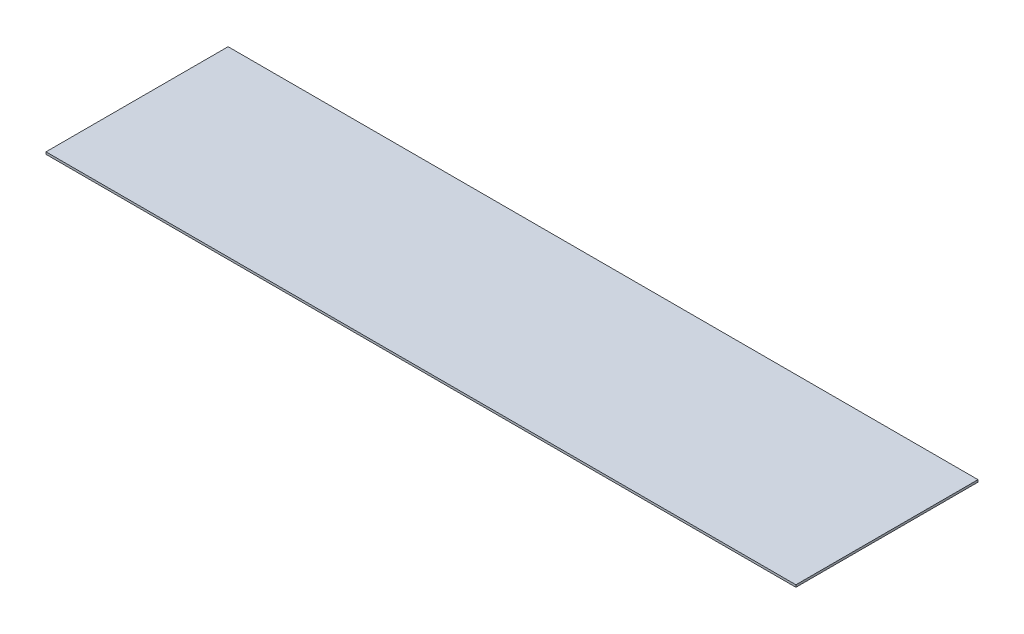
ISO-10303-21;
HEADER;
FILE_DESCRIPTION(('STEP AP214'),'2;1');
FILE_NAME('part.step','',(''),(''),'','','');
FILE_SCHEMA(('AUTOMOTIVE_DESIGN { 1 0 10303 214 1 1 1 1 }'));
ENDSEC;
DATA;
#1=APPLICATION_CONTEXT('core data for automotive mechanical design processes');
#2=APPLICATION_PROTOCOL_DEFINITION('international standard','automotive_design',2000,#1);
#3=PRODUCT_CONTEXT('',#1,'mechanical');
#4=PRODUCT('Part','Part','',(#3));
#5=PRODUCT_RELATED_PRODUCT_CATEGORY('part','',(#4));
#6=PRODUCT_DEFINITION_FORMATION('','',#4);
#7=PRODUCT_DEFINITION_CONTEXT('part definition',#1,'design');
#8=PRODUCT_DEFINITION('design','',#6,#7);
#9=PRODUCT_DEFINITION_SHAPE('','',#8);
#10=(LENGTH_UNIT() NAMED_UNIT(*) SI_UNIT(.MILLI.,.METRE.));
#11=(NAMED_UNIT(*) PLANE_ANGLE_UNIT() SI_UNIT($,.RADIAN.));
#12=(NAMED_UNIT(*) SI_UNIT($,.STERADIAN.) SOLID_ANGLE_UNIT());
#13=UNCERTAINTY_MEASURE_WITH_UNIT(LENGTH_MEASURE(1.E-05),#10,'distance_accuracy_value','');
#14=(GEOMETRIC_REPRESENTATION_CONTEXT(3) GLOBAL_UNCERTAINTY_ASSIGNED_CONTEXT((#13)) GLOBAL_UNIT_ASSIGNED_CONTEXT((#10,
#11,#12)) REPRESENTATION_CONTEXT('',''));
#15=CARTESIAN_POINT('',(0.,0.,0.));
#16=DIRECTION('',(0.,0.,1.));
#17=DIRECTION('',(1.,0.,0.));
#18=AXIS2_PLACEMENT_3D('',#15,#16,#17);
#19=CARTESIAN_POINT('',(0.,2.54,0.));
#20=DIRECTION('',(1.,0.,0.));
#21=DIRECTION('',(0.,0.,-1.));
#22=AXIS2_PLACEMENT_3D('',#19,#20,#21);
#23=PLANE('',#22);
#24=DIRECTION('',(0.,0.,1.));
#25=VECTOR('',#24,1.);
#26=CARTESIAN_POINT('',(0.,0.,0.));
#27=LINE('',#26,#25);
#28=CARTESIAN_POINT('',(0.,0.,-209.7));
#29=VERTEX_POINT('',#28);
#30=CARTESIAN_POINT('',(0.,0.,0.));
#31=VERTEX_POINT('',#30);
#32=EDGE_CURVE('E96',#29,#31,#27,.T.);
#33=ORIENTED_EDGE('',*,*,#32,.T.);
#34=DIRECTION('',(0.,-1.,0.));
#35=VECTOR('',#34,1.);
#36=CARTESIAN_POINT('',(0.,2.54,0.));
#37=LINE('',#36,#35);
#38=CARTESIAN_POINT('',(0.,2.54,0.));
#39=VERTEX_POINT('',#38);
#40=EDGE_CURVE('E11',#39,#31,#37,.T.);
#41=ORIENTED_EDGE('',*,*,#40,.F.);
#42=DIRECTION('',(0.,0.,1.));
#43=VECTOR('',#42,1.);
#44=CARTESIAN_POINT('',(0.,2.54,0.));
#45=LINE('',#44,#43);
#46=CARTESIAN_POINT('',(0.,2.54,-209.7));
#47=VERTEX_POINT('',#46);
#48=EDGE_CURVE('E84',#47,#39,#45,.T.);
#49=ORIENTED_EDGE('',*,*,#48,.F.);
#50=DIRECTION('',(0.,-1.,0.));
#51=VECTOR('',#50,1.);
#52=CARTESIAN_POINT('',(0.,2.54,-209.7));
#53=LINE('',#52,#51);
#54=EDGE_CURVE('E92',#47,#29,#53,.T.);
#55=ORIENTED_EDGE('',*,*,#54,.T.);
#56=EDGE_LOOP('',(#33,#41,#49,#55));
#57=FACE_BOUND('',#56,.T.);
#58=ADVANCED_FACE('F33',(#57),#23,.F.);
#59=CARTESIAN_POINT('',(0.,2.54,0.));
#60=DIRECTION('',(0.,0.,-1.));
#61=DIRECTION('',(-1.,0.,0.));
#62=AXIS2_PLACEMENT_3D('',#59,#60,#61);
#63=PLANE('',#62);
#64=DIRECTION('',(1.,0.,0.));
#65=VECTOR('',#64,1.);
#66=CARTESIAN_POINT('',(0.,0.,0.));
#67=LINE('',#66,#65);
#68=CARTESIAN_POINT('',(863.6,0.,0.));
#69=VERTEX_POINT('',#68);
#70=EDGE_CURVE('E88',#31,#69,#67,.T.);
#71=ORIENTED_EDGE('',*,*,#70,.T.);
#72=DIRECTION('',(0.,-1.,0.));
#73=VECTOR('',#72,1.);
#74=CARTESIAN_POINT('',(863.6,2.54,0.));
#75=LINE('',#74,#73);
#76=CARTESIAN_POINT('',(863.6,2.54,0.));
#77=VERTEX_POINT('',#76);
#78=EDGE_CURVE('E41',#77,#69,#75,.T.);
#79=ORIENTED_EDGE('',*,*,#78,.F.);
#80=DIRECTION('',(1.,0.,0.));
#81=VECTOR('',#80,1.);
#82=CARTESIAN_POINT('',(0.,2.54,0.));
#83=LINE('',#82,#81);
#84=EDGE_CURVE('E79',#39,#77,#83,.T.);
#85=ORIENTED_EDGE('',*,*,#84,.F.);
#86=ORIENTED_EDGE('',*,*,#40,.T.);
#87=EDGE_LOOP('',(#71,#79,#85,#86));
#88=FACE_BOUND('',#87,.T.);
#89=ADVANCED_FACE('F87',(#88),#63,.F.);
#90=CARTESIAN_POINT('',(863.6,2.54,0.));
#91=DIRECTION('',(-1.,0.,0.));
#92=DIRECTION('',(0.,0.,1.));
#93=AXIS2_PLACEMENT_3D('',#90,#91,#92);
#94=PLANE('',#93);
#95=DIRECTION('',(0.,0.,-1.));
#96=VECTOR('',#95,1.);
#97=CARTESIAN_POINT('',(863.6,0.,0.));
#98=LINE('',#97,#96);
#99=CARTESIAN_POINT('',(863.6,0.,-209.7));
#100=VERTEX_POINT('',#99);
#101=EDGE_CURVE('E66',#69,#100,#98,.T.);
#102=ORIENTED_EDGE('',*,*,#101,.T.);
#103=DIRECTION('',(0.,-1.,0.));
#104=VECTOR('',#103,1.);
#105=CARTESIAN_POINT('',(863.6,2.54,-209.7));
#106=LINE('',#105,#104);
#107=CARTESIAN_POINT('',(863.6,2.54,-209.7));
#108=VERTEX_POINT('',#107);
#109=EDGE_CURVE('E89',#108,#100,#106,.T.);
#110=ORIENTED_EDGE('',*,*,#109,.F.);
#111=DIRECTION('',(0.,0.,-1.));
#112=VECTOR('',#111,1.);
#113=CARTESIAN_POINT('',(863.6,2.54,0.));
#114=LINE('',#113,#112);
#115=EDGE_CURVE('E82',#77,#108,#114,.T.);
#116=ORIENTED_EDGE('',*,*,#115,.F.);
#117=ORIENTED_EDGE('',*,*,#78,.T.);
#118=EDGE_LOOP('',(#102,#110,#116,#117));
#119=FACE_BOUND('',#118,.T.);
#120=ADVANCED_FACE('F90',(#119),#94,.F.);
#121=CARTESIAN_POINT('',(0.,2.54,-209.7));
#122=DIRECTION('',(0.,0.,1.));
#123=DIRECTION('',(1.,0.,0.));
#124=AXIS2_PLACEMENT_3D('',#121,#122,#123);
#125=PLANE('',#124);
#126=DIRECTION('',(-1.,0.,0.));
#127=VECTOR('',#126,1.);
#128=CARTESIAN_POINT('',(0.,0.,-209.7));
#129=LINE('',#128,#127);
#130=EDGE_CURVE('E72',#100,#29,#129,.T.);
#131=ORIENTED_EDGE('',*,*,#130,.T.);
#132=ORIENTED_EDGE('',*,*,#54,.F.);
#133=DIRECTION('',(-1.,0.,0.));
#134=VECTOR('',#133,1.);
#135=CARTESIAN_POINT('',(0.,2.54,-209.7));
#136=LINE('',#135,#134);
#137=EDGE_CURVE('E49',#108,#47,#136,.T.);
#138=ORIENTED_EDGE('',*,*,#137,.F.);
#139=ORIENTED_EDGE('',*,*,#109,.T.);
#140=EDGE_LOOP('',(#131,#132,#138,#139));
#141=FACE_BOUND('',#140,.T.);
#142=ADVANCED_FACE('F103',(#141),#125,.F.);
#143=CARTESIAN_POINT('',(0.,2.54,0.));
#144=DIRECTION('',(0.,-1.,0.));
#145=DIRECTION('',(0.,0.,-1.));
#146=AXIS2_PLACEMENT_3D('',#143,#144,#145);
#147=PLANE('',#146);
#148=ORIENTED_EDGE('',*,*,#48,.T.);
#149=ORIENTED_EDGE('',*,*,#84,.T.);
#150=ORIENTED_EDGE('',*,*,#115,.T.);
#151=ORIENTED_EDGE('',*,*,#137,.T.);
#152=EDGE_LOOP('',(#148,#149,#150,#151));
#153=FACE_BOUND('',#152,.T.);
#154=ADVANCED_FACE('F80',(#153),#147,.F.);
#155=CARTESIAN_POINT('',(0.,0.,0.));
#156=DIRECTION('',(0.,-1.,0.));
#157=DIRECTION('',(0.,0.,-1.));
#158=AXIS2_PLACEMENT_3D('',#155,#156,#157);
#159=PLANE('',#158);
#160=ORIENTED_EDGE('',*,*,#32,.F.);
#161=ORIENTED_EDGE('',*,*,#130,.F.);
#162=ORIENTED_EDGE('',*,*,#101,.F.);
#163=ORIENTED_EDGE('',*,*,#70,.F.);
#164=EDGE_LOOP('',(#160,#161,#162,#163));
#165=FACE_BOUND('',#164,.T.);
#166=ADVANCED_FACE('F106',(#165),#159,.T.);
#167=CLOSED_SHELL('',(#58,#89,#120,#142,#154,#166));
#168=MANIFOLD_SOLID_BREP('B2',#167);
#169=ADVANCED_BREP_SHAPE_REPRESENTATION('',(#18,#168),#14);
#170=SHAPE_DEFINITION_REPRESENTATION(#9,#169);
ENDSEC;
END-ISO-10303-21;
